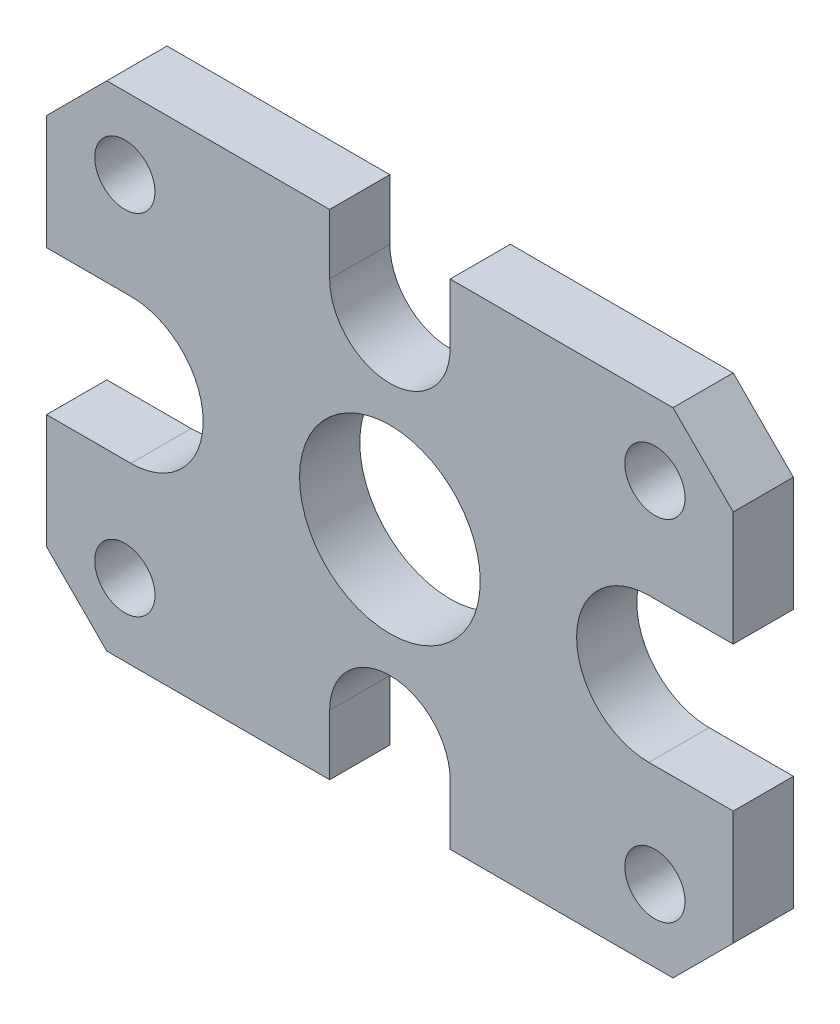
ISO-10303-21;
HEADER;
FILE_DESCRIPTION(('STEP AP214'),'2;1');
FILE_NAME('part.step','',(''),(''),'','','');
FILE_SCHEMA(('AUTOMOTIVE_DESIGN { 1 0 10303 214 1 1 1 1 }'));
ENDSEC;
DATA;
#1=APPLICATION_CONTEXT('core data for automotive mechanical design processes');
#2=APPLICATION_PROTOCOL_DEFINITION('international standard','automotive_design',2000,#1);
#3=PRODUCT_CONTEXT('',#1,'mechanical');
#4=PRODUCT('Part','Part','',(#3));
#5=PRODUCT_RELATED_PRODUCT_CATEGORY('part','',(#4));
#6=PRODUCT_DEFINITION_FORMATION('','',#4);
#7=PRODUCT_DEFINITION_CONTEXT('part definition',#1,'design');
#8=PRODUCT_DEFINITION('design','',#6,#7);
#9=PRODUCT_DEFINITION_SHAPE('','',#8);
#10=(LENGTH_UNIT() NAMED_UNIT(*) SI_UNIT(.MILLI.,.METRE.));
#11=(NAMED_UNIT(*) PLANE_ANGLE_UNIT() SI_UNIT($,.RADIAN.));
#12=(NAMED_UNIT(*) SI_UNIT($,.STERADIAN.) SOLID_ANGLE_UNIT());
#13=UNCERTAINTY_MEASURE_WITH_UNIT(LENGTH_MEASURE(1.E-05),#10,'distance_accuracy_value','');
#14=(GEOMETRIC_REPRESENTATION_CONTEXT(3) GLOBAL_UNCERTAINTY_ASSIGNED_CONTEXT((#13)) GLOBAL_UNIT_ASSIGNED_CONTEXT((#10,
#11,#12)) REPRESENTATION_CONTEXT('',''));
#15=CARTESIAN_POINT('',(0.,0.,0.));
#16=DIRECTION('',(0.,0.,1.));
#17=DIRECTION('',(1.,0.,0.));
#18=AXIS2_PLACEMENT_3D('',#15,#16,#17);
#19=CARTESIAN_POINT('',(-43.,0.,5.));
#20=DIRECTION('',(0.,0.,-1.));
#21=DIRECTION('',(-1.,0.,0.));
#22=AXIS2_PLACEMENT_3D('',#19,#20,#21);
#23=PLANE('',#22);
#24=DIRECTION('',(0.,-1.,0.));
#25=VECTOR('',#24,1.);
#26=CARTESIAN_POINT('',(-57.,-31.,5.));
#27=LINE('',#26,#25);
#28=CARTESIAN_POINT('',(-57.,-12.,5.));
#29=VERTEX_POINT('',#28);
#30=CARTESIAN_POINT('',(-57.,-31.,5.));
#31=VERTEX_POINT('',#30);
#32=EDGE_CURVE('E312',#29,#31,#27,.T.);
#33=ORIENTED_EDGE('',*,*,#32,.T.);
#34=DIRECTION('',(0.707106781186548,-0.707106781186548,0.));
#35=VECTOR('',#34,1.);
#36=CARTESIAN_POINT('',(-57.,-31.,5.));
#37=LINE('',#36,#35);
#38=CARTESIAN_POINT('',(-47.,-41.,5.));
#39=VERTEX_POINT('',#38);
#40=EDGE_CURVE('E152',#31,#39,#37,.T.);
#41=ORIENTED_EDGE('',*,*,#40,.T.);
#42=DIRECTION('',(1.,0.,0.));
#43=VECTOR('',#42,1.);
#44=CARTESIAN_POINT('',(-9.99999999999999,-41.,5.));
#45=LINE('',#44,#43);
#46=CARTESIAN_POINT('',(-9.99999999999999,-41.,5.));
#47=VERTEX_POINT('',#46);
#48=EDGE_CURVE('E397',#39,#47,#45,.T.);
#49=ORIENTED_EDGE('',*,*,#48,.T.);
#50=DIRECTION('',(0.,1.,0.));
#51=VECTOR('',#50,1.);
#52=CARTESIAN_POINT('',(-9.99999999999999,-41.,5.));
#53=LINE('',#52,#51);
#54=CARTESIAN_POINT('',(-9.99999999999999,-31.,5.));
#55=VERTEX_POINT('',#54);
#56=EDGE_CURVE('E417',#47,#55,#53,.T.);
#57=ORIENTED_EDGE('',*,*,#56,.T.);
#58=CARTESIAN_POINT('',(0.,-31.,5.));
#59=DIRECTION('',(0.,0.,-1.));
#60=DIRECTION('',(-1.,0.,0.));
#61=AXIS2_PLACEMENT_3D('',#58,#59,#60);
#62=CIRCLE('',#61,10.);
#63=CARTESIAN_POINT('',(10.,-31.,5.));
#64=VERTEX_POINT('',#63);
#65=EDGE_CURVE('E413',#55,#64,#62,.T.);
#66=ORIENTED_EDGE('',*,*,#65,.T.);
#67=DIRECTION('',(0.,-1.,0.));
#68=VECTOR('',#67,1.);
#69=CARTESIAN_POINT('',(10.,-31.,5.));
#70=LINE('',#69,#68);
#71=CARTESIAN_POINT('',(10.,-41.,5.));
#72=VERTEX_POINT('',#71);
#73=EDGE_CURVE('E416',#64,#72,#70,.T.);
#74=ORIENTED_EDGE('',*,*,#73,.T.);
#75=DIRECTION('',(1.,0.,0.));
#76=VECTOR('',#75,1.);
#77=CARTESIAN_POINT('',(47.,-41.,5.));
#78=LINE('',#77,#76);
#79=CARTESIAN_POINT('',(47.,-41.,5.));
#80=VERTEX_POINT('',#79);
#81=EDGE_CURVE('E421',#72,#80,#78,.T.);
#82=ORIENTED_EDGE('',*,*,#81,.T.);
#83=DIRECTION('',(0.707106781186548,0.707106781186548,0.));
#84=VECTOR('',#83,1.);
#85=CARTESIAN_POINT('',(57.,-31.,5.));
#86=LINE('',#85,#84);
#87=CARTESIAN_POINT('',(57.,-31.,5.));
#88=VERTEX_POINT('',#87);
#89=EDGE_CURVE('E428',#80,#88,#86,.T.);
#90=ORIENTED_EDGE('',*,*,#89,.T.);
#91=DIRECTION('',(0.,1.,0.));
#92=VECTOR('',#91,1.);
#93=CARTESIAN_POINT('',(57.,-31.,5.));
#94=LINE('',#93,#92);
#95=CARTESIAN_POINT('',(57.,-12.,5.));
#96=VERTEX_POINT('',#95);
#97=EDGE_CURVE('E431',#88,#96,#94,.T.);
#98=ORIENTED_EDGE('',*,*,#97,.T.);
#99=DIRECTION('',(-1.,0.,0.));
#100=VECTOR('',#99,1.);
#101=CARTESIAN_POINT('',(43.,-12.,5.));
#102=LINE('',#101,#100);
#103=CARTESIAN_POINT('',(43.,-12.,5.));
#104=VERTEX_POINT('',#103);
#105=EDGE_CURVE('E434',#96,#104,#102,.T.);
#106=ORIENTED_EDGE('',*,*,#105,.T.);
#107=CARTESIAN_POINT('',(43.,0.,5.));
#108=DIRECTION('',(0.,0.,-1.));
#109=DIRECTION('',(1.,0.,0.));
#110=AXIS2_PLACEMENT_3D('',#107,#108,#109);
#111=CIRCLE('',#110,12.);
#112=CARTESIAN_POINT('',(43.,12.,5.));
#113=VERTEX_POINT('',#112);
#114=EDGE_CURVE('E437',#104,#113,#111,.T.);
#115=ORIENTED_EDGE('',*,*,#114,.T.);
#116=DIRECTION('',(1.,0.,0.));
#117=VECTOR('',#116,1.);
#118=CARTESIAN_POINT('',(57.,12.,5.));
#119=LINE('',#118,#117);
#120=CARTESIAN_POINT('',(57.,12.,5.));
#121=VERTEX_POINT('',#120);
#122=EDGE_CURVE('E440',#113,#121,#119,.T.);
#123=ORIENTED_EDGE('',*,*,#122,.T.);
#124=DIRECTION('',(0.,1.,0.));
#125=VECTOR('',#124,1.);
#126=CARTESIAN_POINT('',(57.,12.,5.));
#127=LINE('',#126,#125);
#128=CARTESIAN_POINT('',(57.,31.,5.));
#129=VERTEX_POINT('',#128);
#130=EDGE_CURVE('E443',#121,#129,#127,.T.);
#131=ORIENTED_EDGE('',*,*,#130,.T.);
#132=DIRECTION('',(-0.707106781186548,0.707106781186547,0.));
#133=VECTOR('',#132,1.);
#134=CARTESIAN_POINT('',(57.,31.,5.));
#135=LINE('',#134,#133);
#136=CARTESIAN_POINT('',(47.,41.,5.));
#137=VERTEX_POINT('',#136);
#138=EDGE_CURVE('E446',#129,#137,#135,.T.);
#139=ORIENTED_EDGE('',*,*,#138,.T.);
#140=DIRECTION('',(-1.,0.,0.));
#141=VECTOR('',#140,1.);
#142=CARTESIAN_POINT('',(47.,41.,5.));
#143=LINE('',#142,#141);
#144=CARTESIAN_POINT('',(10.,41.,5.));
#145=VERTEX_POINT('',#144);
#146=EDGE_CURVE('E449',#137,#145,#143,.T.);
#147=ORIENTED_EDGE('',*,*,#146,.T.);
#148=DIRECTION('',(0.,-1.,0.));
#149=VECTOR('',#148,1.);
#150=CARTESIAN_POINT('',(10.,31.,5.));
#151=LINE('',#150,#149);
#152=CARTESIAN_POINT('',(10.,31.,5.));
#153=VERTEX_POINT('',#152);
#154=EDGE_CURVE('E452',#145,#153,#151,.T.);
#155=ORIENTED_EDGE('',*,*,#154,.T.);
#156=CARTESIAN_POINT('',(0.,31.,5.));
#157=DIRECTION('',(0.,0.,-1.));
#158=DIRECTION('',(1.,0.,0.));
#159=AXIS2_PLACEMENT_3D('',#156,#157,#158);
#160=CIRCLE('',#159,10.);
#161=CARTESIAN_POINT('',(-9.99999999999999,31.,5.));
#162=VERTEX_POINT('',#161);
#163=EDGE_CURVE('E455',#153,#162,#160,.T.);
#164=ORIENTED_EDGE('',*,*,#163,.T.);
#165=DIRECTION('',(0.,1.,0.));
#166=VECTOR('',#165,1.);
#167=CARTESIAN_POINT('',(-9.99999999999999,41.,5.));
#168=LINE('',#167,#166);
#169=CARTESIAN_POINT('',(-9.99999999999999,41.,5.));
#170=VERTEX_POINT('',#169);
#171=EDGE_CURVE('E458',#162,#170,#168,.T.);
#172=ORIENTED_EDGE('',*,*,#171,.T.);
#173=DIRECTION('',(-1.,0.,0.));
#174=VECTOR('',#173,1.);
#175=CARTESIAN_POINT('',(-9.99999999999999,41.,5.));
#176=LINE('',#175,#174);
#177=CARTESIAN_POINT('',(-47.,41.,5.));
#178=VERTEX_POINT('',#177);
#179=EDGE_CURVE('E461',#170,#178,#176,.T.);
#180=ORIENTED_EDGE('',*,*,#179,.T.);
#181=DIRECTION('',(-0.707106781186548,-0.707106781186548,0.));
#182=VECTOR('',#181,1.);
#183=CARTESIAN_POINT('',(-57.,31.,5.));
#184=LINE('',#183,#182);
#185=CARTESIAN_POINT('',(-57.,31.,5.));
#186=VERTEX_POINT('',#185);
#187=EDGE_CURVE('E464',#178,#186,#184,.T.);
#188=ORIENTED_EDGE('',*,*,#187,.T.);
#189=DIRECTION('',(0.,-1.,0.));
#190=VECTOR('',#189,1.);
#191=CARTESIAN_POINT('',(-57.,12.,5.));
#192=LINE('',#191,#190);
#193=CARTESIAN_POINT('',(-57.,12.,5.));
#194=VERTEX_POINT('',#193);
#195=EDGE_CURVE('E219',#186,#194,#192,.T.);
#196=ORIENTED_EDGE('',*,*,#195,.T.);
#197=DIRECTION('',(1.,0.,0.));
#198=VECTOR('',#197,1.);
#199=CARTESIAN_POINT('',(-57.,12.,5.));
#200=LINE('',#199,#198);
#201=CARTESIAN_POINT('',(-43.,12.,5.));
#202=VERTEX_POINT('',#201);
#203=EDGE_CURVE('E213',#194,#202,#200,.T.);
#204=ORIENTED_EDGE('',*,*,#203,.T.);
#205=CARTESIAN_POINT('',(-43.,0.,5.));
#206=DIRECTION('',(0.,0.,-1.));
#207=DIRECTION('',(-1.,0.,0.));
#208=AXIS2_PLACEMENT_3D('',#205,#206,#207);
#209=CIRCLE('',#208,12.);
#210=CARTESIAN_POINT('',(-43.,-12.,5.));
#211=VERTEX_POINT('',#210);
#212=EDGE_CURVE('E217',#202,#211,#209,.T.);
#213=ORIENTED_EDGE('',*,*,#212,.T.);
#214=DIRECTION('',(-1.,0.,0.));
#215=VECTOR('',#214,1.);
#216=CARTESIAN_POINT('',(-43.,-12.,5.));
#217=LINE('',#216,#215);
#218=EDGE_CURVE('E61',#211,#29,#217,.T.);
#219=ORIENTED_EDGE('',*,*,#218,.T.);
#220=EDGE_LOOP('',(#33,#41,#49,#57,#66,#74,#82,#90,#98,#106,#115,#123,#131,#139,#147,#155,#164,
#172,#180,#188,#196,#204,#213,#219));
#221=FACE_BOUND('',#220,.T.);
#222=CARTESIAN_POINT('',(0.,0.,5.));
#223=DIRECTION('',(0.,0.,1.));
#224=DIRECTION('',(1.,0.,0.));
#225=AXIS2_PLACEMENT_3D('',#222,#223,#224);
#226=CIRCLE('',#225,15.);
#227=CARTESIAN_POINT('',(15.,0.,5.));
#228=VERTEX_POINT('',#227);
#229=EDGE_CURVE('E246',#228,#228,#226,.T.);
#230=ORIENTED_EDGE('',*,*,#229,.F.);
#231=EDGE_LOOP('',(#230));
#232=FACE_BOUND('',#231,.T.);
#233=CARTESIAN_POINT('',(-44.,-29.,5.));
#234=DIRECTION('',(0.,0.,1.));
#235=DIRECTION('',(1.,0.,0.));
#236=AXIS2_PLACEMENT_3D('',#233,#234,#235);
#237=CIRCLE('',#236,5.);
#238=CARTESIAN_POINT('',(-39.,-29.,5.));
#239=VERTEX_POINT('',#238);
#240=EDGE_CURVE('E546',#239,#239,#237,.T.);
#241=ORIENTED_EDGE('',*,*,#240,.F.);
#242=EDGE_LOOP('',(#241));
#243=FACE_BOUND('',#242,.T.);
#244=CARTESIAN_POINT('',(-44.,29.,5.));
#245=DIRECTION('',(0.,0.,1.));
#246=DIRECTION('',(-1.,0.,0.));
#247=AXIS2_PLACEMENT_3D('',#244,#245,#246);
#248=CIRCLE('',#247,5.);
#249=CARTESIAN_POINT('',(-49.,29.,5.));
#250=VERTEX_POINT('',#249);
#251=EDGE_CURVE('E538',#250,#250,#248,.T.);
#252=ORIENTED_EDGE('',*,*,#251,.F.);
#253=EDGE_LOOP('',(#252));
#254=FACE_BOUND('',#253,.T.);
#255=CARTESIAN_POINT('',(44.,-29.,5.));
#256=DIRECTION('',(0.,0.,1.));
#257=DIRECTION('',(-1.,0.,0.));
#258=AXIS2_PLACEMENT_3D('',#255,#256,#257);
#259=CIRCLE('',#258,5.);
#260=CARTESIAN_POINT('',(39.,-29.,5.));
#261=VERTEX_POINT('',#260);
#262=EDGE_CURVE('E530',#261,#261,#259,.T.);
#263=ORIENTED_EDGE('',*,*,#262,.F.);
#264=EDGE_LOOP('',(#263));
#265=FACE_BOUND('',#264,.T.);
#266=CARTESIAN_POINT('',(44.,29.,5.));
#267=DIRECTION('',(0.,0.,1.));
#268=DIRECTION('',(1.,0.,0.));
#269=AXIS2_PLACEMENT_3D('',#266,#267,#268);
#270=CIRCLE('',#269,5.);
#271=CARTESIAN_POINT('',(49.,29.,5.));
#272=VERTEX_POINT('',#271);
#273=EDGE_CURVE('E519',#272,#272,#270,.T.);
#274=ORIENTED_EDGE('',*,*,#273,.F.);
#275=EDGE_LOOP('',(#274));
#276=FACE_BOUND('',#275,.T.);
#277=ADVANCED_FACE('F43',(#221,#232,#243,#254,#265,#276),#23,.F.);
#278=CARTESIAN_POINT('',(-43.,0.,-5.));
#279=DIRECTION('',(0.,0.,-1.));
#280=DIRECTION('',(-1.,0.,0.));
#281=AXIS2_PLACEMENT_3D('',#278,#279,#280);
#282=PLANE('',#281);
#283=CARTESIAN_POINT('',(44.,-29.,-5.));
#284=DIRECTION('',(0.,0.,1.));
#285=DIRECTION('',(-1.,0.,0.));
#286=AXIS2_PLACEMENT_3D('',#283,#284,#285);
#287=CIRCLE('',#286,5.);
#288=CARTESIAN_POINT('',(39.,-29.,-5.));
#289=VERTEX_POINT('',#288);
#290=EDGE_CURVE('E527',#289,#289,#287,.T.);
#291=ORIENTED_EDGE('',*,*,#290,.T.);
#292=EDGE_LOOP('',(#291));
#293=FACE_BOUND('',#292,.T.);
#294=CARTESIAN_POINT('',(-44.,-29.,-5.));
#295=DIRECTION('',(0.,0.,1.));
#296=DIRECTION('',(1.,0.,0.));
#297=AXIS2_PLACEMENT_3D('',#294,#295,#296);
#298=CIRCLE('',#297,5.);
#299=CARTESIAN_POINT('',(-39.,-29.,-5.));
#300=VERTEX_POINT('',#299);
#301=EDGE_CURVE('E542',#300,#300,#298,.T.);
#302=ORIENTED_EDGE('',*,*,#301,.T.);
#303=EDGE_LOOP('',(#302));
#304=FACE_BOUND('',#303,.T.);
#305=DIRECTION('',(0.,-1.,0.));
#306=VECTOR('',#305,1.);
#307=CARTESIAN_POINT('',(-57.,-31.,-5.));
#308=LINE('',#307,#306);
#309=CARTESIAN_POINT('',(-57.,-12.,-5.));
#310=VERTEX_POINT('',#309);
#311=CARTESIAN_POINT('',(-57.,-31.,-5.));
#312=VERTEX_POINT('',#311);
#313=EDGE_CURVE('E241',#310,#312,#308,.T.);
#314=ORIENTED_EDGE('',*,*,#313,.F.);
#315=DIRECTION('',(-1.,0.,0.));
#316=VECTOR('',#315,1.);
#317=CARTESIAN_POINT('',(-43.,-12.,-5.));
#318=LINE('',#317,#316);
#319=CARTESIAN_POINT('',(-43.,-12.,-5.));
#320=VERTEX_POINT('',#319);
#321=EDGE_CURVE('E144',#320,#310,#318,.T.);
#322=ORIENTED_EDGE('',*,*,#321,.F.);
#323=CARTESIAN_POINT('',(-43.,0.,-5.));
#324=DIRECTION('',(0.,0.,-1.));
#325=DIRECTION('',(-1.,0.,0.));
#326=AXIS2_PLACEMENT_3D('',#323,#324,#325);
#327=CIRCLE('',#326,12.);
#328=CARTESIAN_POINT('',(-43.,12.,-5.));
#329=VERTEX_POINT('',#328);
#330=EDGE_CURVE('E138',#329,#320,#327,.T.);
#331=ORIENTED_EDGE('',*,*,#330,.F.);
#332=DIRECTION('',(1.,0.,0.));
#333=VECTOR('',#332,1.);
#334=CARTESIAN_POINT('',(-57.,12.,-5.));
#335=LINE('',#334,#333);
#336=CARTESIAN_POINT('',(-57.,12.,-5.));
#337=VERTEX_POINT('',#336);
#338=EDGE_CURVE('E228',#337,#329,#335,.T.);
#339=ORIENTED_EDGE('',*,*,#338,.F.);
#340=DIRECTION('',(0.,-1.,0.));
#341=VECTOR('',#340,1.);
#342=CARTESIAN_POINT('',(-57.,12.,-5.));
#343=LINE('',#342,#341);
#344=CARTESIAN_POINT('',(-57.,31.,-5.));
#345=VERTEX_POINT('',#344);
#346=EDGE_CURVE('E303',#345,#337,#343,.T.);
#347=ORIENTED_EDGE('',*,*,#346,.F.);
#348=DIRECTION('',(-0.707106781186548,-0.707106781186548,0.));
#349=VECTOR('',#348,1.);
#350=CARTESIAN_POINT('',(-57.,31.,-5.));
#351=LINE('',#350,#349);
#352=CARTESIAN_POINT('',(-47.,41.,-5.));
#353=VERTEX_POINT('',#352);
#354=EDGE_CURVE('E300',#353,#345,#351,.T.);
#355=ORIENTED_EDGE('',*,*,#354,.F.);
#356=DIRECTION('',(-1.,0.,0.));
#357=VECTOR('',#356,1.);
#358=CARTESIAN_POINT('',(-9.99999999999999,41.,-5.));
#359=LINE('',#358,#357);
#360=CARTESIAN_POINT('',(-9.99999999999999,41.,-5.));
#361=VERTEX_POINT('',#360);
#362=EDGE_CURVE('E297',#361,#353,#359,.T.);
#363=ORIENTED_EDGE('',*,*,#362,.F.);
#364=DIRECTION('',(0.,1.,0.));
#365=VECTOR('',#364,1.);
#366=CARTESIAN_POINT('',(-9.99999999999999,41.,-5.));
#367=LINE('',#366,#365);
#368=CARTESIAN_POINT('',(-9.99999999999999,31.,-5.));
#369=VERTEX_POINT('',#368);
#370=EDGE_CURVE('E294',#369,#361,#367,.T.);
#371=ORIENTED_EDGE('',*,*,#370,.F.);
#372=CARTESIAN_POINT('',(0.,31.,-5.));
#373=DIRECTION('',(0.,0.,-1.));
#374=DIRECTION('',(1.,0.,0.));
#375=AXIS2_PLACEMENT_3D('',#372,#373,#374);
#376=CIRCLE('',#375,10.);
#377=CARTESIAN_POINT('',(10.,31.,-5.));
#378=VERTEX_POINT('',#377);
#379=EDGE_CURVE('E291',#378,#369,#376,.T.);
#380=ORIENTED_EDGE('',*,*,#379,.F.);
#381=DIRECTION('',(0.,-1.,0.));
#382=VECTOR('',#381,1.);
#383=CARTESIAN_POINT('',(10.,31.,-5.));
#384=LINE('',#383,#382);
#385=CARTESIAN_POINT('',(10.,41.,-5.));
#386=VERTEX_POINT('',#385);
#387=EDGE_CURVE('E288',#386,#378,#384,.T.);
#388=ORIENTED_EDGE('',*,*,#387,.F.);
#389=DIRECTION('',(-1.,0.,0.));
#390=VECTOR('',#389,1.);
#391=CARTESIAN_POINT('',(47.,41.,-5.));
#392=LINE('',#391,#390);
#393=CARTESIAN_POINT('',(47.,41.,-5.));
#394=VERTEX_POINT('',#393);
#395=EDGE_CURVE('E285',#394,#386,#392,.T.);
#396=ORIENTED_EDGE('',*,*,#395,.F.);
#397=DIRECTION('',(-0.707106781186548,0.707106781186547,0.));
#398=VECTOR('',#397,1.);
#399=CARTESIAN_POINT('',(57.,31.,-5.));
#400=LINE('',#399,#398);
#401=CARTESIAN_POINT('',(57.,31.,-5.));
#402=VERTEX_POINT('',#401);
#403=EDGE_CURVE('E282',#402,#394,#400,.T.);
#404=ORIENTED_EDGE('',*,*,#403,.F.);
#405=DIRECTION('',(0.,1.,0.));
#406=VECTOR('',#405,1.);
#407=CARTESIAN_POINT('',(57.,12.,-5.));
#408=LINE('',#407,#406);
#409=CARTESIAN_POINT('',(57.,12.,-5.));
#410=VERTEX_POINT('',#409);
#411=EDGE_CURVE('E279',#410,#402,#408,.T.);
#412=ORIENTED_EDGE('',*,*,#411,.F.);
#413=DIRECTION('',(1.,0.,0.));
#414=VECTOR('',#413,1.);
#415=CARTESIAN_POINT('',(57.,12.,-5.));
#416=LINE('',#415,#414);
#417=CARTESIAN_POINT('',(43.,12.,-5.));
#418=VERTEX_POINT('',#417);
#419=EDGE_CURVE('E276',#418,#410,#416,.T.);
#420=ORIENTED_EDGE('',*,*,#419,.F.);
#421=CARTESIAN_POINT('',(43.,0.,-5.));
#422=DIRECTION('',(0.,0.,-1.));
#423=DIRECTION('',(1.,0.,0.));
#424=AXIS2_PLACEMENT_3D('',#421,#422,#423);
#425=CIRCLE('',#424,12.);
#426=CARTESIAN_POINT('',(43.,-12.,-5.));
#427=VERTEX_POINT('',#426);
#428=EDGE_CURVE('E273',#427,#418,#425,.T.);
#429=ORIENTED_EDGE('',*,*,#428,.F.);
#430=DIRECTION('',(-1.,0.,0.));
#431=VECTOR('',#430,1.);
#432=CARTESIAN_POINT('',(43.,-12.,-5.));
#433=LINE('',#432,#431);
#434=CARTESIAN_POINT('',(57.,-12.,-5.));
#435=VERTEX_POINT('',#434);
#436=EDGE_CURVE('E270',#435,#427,#433,.T.);
#437=ORIENTED_EDGE('',*,*,#436,.F.);
#438=DIRECTION('',(0.,1.,0.));
#439=VECTOR('',#438,1.);
#440=CARTESIAN_POINT('',(57.,-31.,-5.));
#441=LINE('',#440,#439);
#442=CARTESIAN_POINT('',(57.,-31.,-5.));
#443=VERTEX_POINT('',#442);
#444=EDGE_CURVE('E267',#443,#435,#441,.T.);
#445=ORIENTED_EDGE('',*,*,#444,.F.);
#446=DIRECTION('',(0.707106781186548,0.707106781186548,0.));
#447=VECTOR('',#446,1.);
#448=CARTESIAN_POINT('',(57.,-31.,-5.));
#449=LINE('',#448,#447);
#450=CARTESIAN_POINT('',(47.,-41.,-5.));
#451=VERTEX_POINT('',#450);
#452=EDGE_CURVE('E264',#451,#443,#449,.T.);
#453=ORIENTED_EDGE('',*,*,#452,.F.);
#454=DIRECTION('',(1.,0.,0.));
#455=VECTOR('',#454,1.);
#456=CARTESIAN_POINT('',(47.,-41.,-5.));
#457=LINE('',#456,#455);
#458=CARTESIAN_POINT('',(10.,-41.,-5.));
#459=VERTEX_POINT('',#458);
#460=EDGE_CURVE('E261',#459,#451,#457,.T.);
#461=ORIENTED_EDGE('',*,*,#460,.F.);
#462=DIRECTION('',(0.,-1.,0.));
#463=VECTOR('',#462,1.);
#464=CARTESIAN_POINT('',(10.,-31.,-5.));
#465=LINE('',#464,#463);
#466=CARTESIAN_POINT('',(10.,-31.,-5.));
#467=VERTEX_POINT('',#466);
#468=EDGE_CURVE('E258',#467,#459,#465,.T.);
#469=ORIENTED_EDGE('',*,*,#468,.F.);
#470=CARTESIAN_POINT('',(0.,-31.,-5.));
#471=DIRECTION('',(0.,0.,-1.));
#472=DIRECTION('',(-1.,0.,0.));
#473=AXIS2_PLACEMENT_3D('',#470,#471,#472);
#474=CIRCLE('',#473,10.);
#475=CARTESIAN_POINT('',(-9.99999999999999,-31.,-5.));
#476=VERTEX_POINT('',#475);
#477=EDGE_CURVE('E255',#476,#467,#474,.T.);
#478=ORIENTED_EDGE('',*,*,#477,.F.);
#479=DIRECTION('',(0.,1.,0.));
#480=VECTOR('',#479,1.);
#481=CARTESIAN_POINT('',(-9.99999999999999,-41.,-5.));
#482=LINE('',#481,#480);
#483=CARTESIAN_POINT('',(-9.99999999999999,-41.,-5.));
#484=VERTEX_POINT('',#483);
#485=EDGE_CURVE('E252',#484,#476,#482,.T.);
#486=ORIENTED_EDGE('',*,*,#485,.F.);
#487=DIRECTION('',(1.,0.,0.));
#488=VECTOR('',#487,1.);
#489=CARTESIAN_POINT('',(-9.99999999999999,-41.,-5.));
#490=LINE('',#489,#488);
#491=CARTESIAN_POINT('',(-47.,-41.,-5.));
#492=VERTEX_POINT('',#491);
#493=EDGE_CURVE('E249',#492,#484,#490,.T.);
#494=ORIENTED_EDGE('',*,*,#493,.F.);
#495=DIRECTION('',(0.707106781186548,-0.707106781186548,0.));
#496=VECTOR('',#495,1.);
#497=CARTESIAN_POINT('',(-57.,-31.,-5.));
#498=LINE('',#497,#496);
#499=EDGE_CURVE('E245',#312,#492,#498,.T.);
#500=ORIENTED_EDGE('',*,*,#499,.F.);
#501=EDGE_LOOP('',(#314,#322,#331,#339,#347,#355,#363,#371,#380,#388,#396,#404,#412,#420,#429,
#437,#445,#453,#461,#469,#478,#486,#494,#500));
#502=FACE_BOUND('',#501,.T.);
#503=CARTESIAN_POINT('',(0.,0.,-5.));
#504=DIRECTION('',(0.,0.,1.));
#505=DIRECTION('',(1.,0.,0.));
#506=AXIS2_PLACEMENT_3D('',#503,#504,#505);
#507=CIRCLE('',#506,15.);
#508=CARTESIAN_POINT('',(15.,0.,-5.));
#509=VERTEX_POINT('',#508);
#510=EDGE_CURVE('E550',#509,#509,#507,.T.);
#511=ORIENTED_EDGE('',*,*,#510,.T.);
#512=EDGE_LOOP('',(#511));
#513=FACE_BOUND('',#512,.T.);
#514=CARTESIAN_POINT('',(-44.,29.,-5.));
#515=DIRECTION('',(0.,0.,1.));
#516=DIRECTION('',(-1.,0.,0.));
#517=AXIS2_PLACEMENT_3D('',#514,#515,#516);
#518=CIRCLE('',#517,5.);
#519=CARTESIAN_POINT('',(-49.,29.,-5.));
#520=VERTEX_POINT('',#519);
#521=EDGE_CURVE('E534',#520,#520,#518,.T.);
#522=ORIENTED_EDGE('',*,*,#521,.T.);
#523=EDGE_LOOP('',(#522));
#524=FACE_BOUND('',#523,.T.);
#525=CARTESIAN_POINT('',(44.,29.,-5.));
#526=DIRECTION('',(0.,0.,1.));
#527=DIRECTION('',(1.,0.,0.));
#528=AXIS2_PLACEMENT_3D('',#525,#526,#527);
#529=CIRCLE('',#528,5.);
#530=CARTESIAN_POINT('',(49.,29.,-5.));
#531=VERTEX_POINT('',#530);
#532=EDGE_CURVE('E522',#531,#531,#529,.T.);
#533=ORIENTED_EDGE('',*,*,#532,.T.);
#534=EDGE_LOOP('',(#533));
#535=FACE_BOUND('',#534,.T.);
#536=ADVANCED_FACE('F401',(#293,#304,#502,#513,#524,#535),#282,.T.);
#537=CARTESIAN_POINT('',(-57.,-31.,5.));
#538=DIRECTION('',(1.,0.,0.));
#539=DIRECTION('',(0.,0.,-1.));
#540=AXIS2_PLACEMENT_3D('',#537,#538,#539);
#541=PLANE('',#540);
#542=ORIENTED_EDGE('',*,*,#313,.T.);
#543=DIRECTION('',(0.,0.,-1.));
#544=VECTOR('',#543,1.);
#545=CARTESIAN_POINT('',(-57.,-31.,5.));
#546=LINE('',#545,#544);
#547=EDGE_CURVE('E11',#31,#312,#546,.T.);
#548=ORIENTED_EDGE('',*,*,#547,.F.);
#549=ORIENTED_EDGE('',*,*,#32,.F.);
#550=DIRECTION('',(0.,0.,-1.));
#551=VECTOR('',#550,1.);
#552=CARTESIAN_POINT('',(-57.,-12.,5.));
#553=LINE('',#552,#551);
#554=EDGE_CURVE('E237',#29,#310,#553,.T.);
#555=ORIENTED_EDGE('',*,*,#554,.T.);
#556=EDGE_LOOP('',(#542,#548,#549,#555));
#557=FACE_BOUND('',#556,.T.);
#558=ADVANCED_FACE('F45',(#557),#541,.F.);
#559=CARTESIAN_POINT('',(-57.,-31.,5.));
#560=DIRECTION('',(0.707106781186548,0.707106781186548,0.));
#561=DIRECTION('',(-0.707106781186548,0.707106781186548,0.));
#562=AXIS2_PLACEMENT_3D('',#559,#560,#561);
#563=PLANE('',#562);
#564=ORIENTED_EDGE('',*,*,#499,.T.);
#565=DIRECTION('',(0.,0.,-1.));
#566=VECTOR('',#565,1.);
#567=CARTESIAN_POINT('',(-47.,-41.,5.));
#568=LINE('',#567,#566);
#569=EDGE_CURVE('E53',#39,#492,#568,.T.);
#570=ORIENTED_EDGE('',*,*,#569,.F.);
#571=ORIENTED_EDGE('',*,*,#40,.F.);
#572=ORIENTED_EDGE('',*,*,#547,.T.);
#573=EDGE_LOOP('',(#564,#570,#571,#572));
#574=FACE_BOUND('',#573,.T.);
#575=ADVANCED_FACE('F819',(#574),#563,.F.);
#576=CARTESIAN_POINT('',(-9.99999999999999,-41.,5.));
#577=DIRECTION('',(0.,1.,0.));
#578=DIRECTION('',(-1.,0.,0.));
#579=AXIS2_PLACEMENT_3D('',#576,#577,#578);
#580=PLANE('',#579);
#581=ORIENTED_EDGE('',*,*,#493,.T.);
#582=DIRECTION('',(0.,0.,-1.));
#583=VECTOR('',#582,1.);
#584=CARTESIAN_POINT('',(-9.99999999999999,-41.,5.));
#585=LINE('',#584,#583);
#586=EDGE_CURVE('E387',#47,#484,#585,.T.);
#587=ORIENTED_EDGE('',*,*,#586,.F.);
#588=ORIENTED_EDGE('',*,*,#48,.F.);
#589=ORIENTED_EDGE('',*,*,#569,.T.);
#590=EDGE_LOOP('',(#581,#587,#588,#589));
#591=FACE_BOUND('',#590,.T.);
#592=ADVANCED_FACE('F395',(#591),#580,.F.);
#593=CARTESIAN_POINT('',(-9.99999999999999,-41.,5.));
#594=DIRECTION('',(-1.,0.,0.));
#595=DIRECTION('',(0.,0.,1.));
#596=AXIS2_PLACEMENT_3D('',#593,#594,#595);
#597=PLANE('',#596);
#598=ORIENTED_EDGE('',*,*,#485,.T.);
#599=DIRECTION('',(0.,0.,-1.));
#600=VECTOR('',#599,1.);
#601=CARTESIAN_POINT('',(-9.99999999999999,-31.,5.));
#602=LINE('',#601,#600);
#603=EDGE_CURVE('E383',#55,#476,#602,.T.);
#604=ORIENTED_EDGE('',*,*,#603,.F.);
#605=ORIENTED_EDGE('',*,*,#56,.F.);
#606=ORIENTED_EDGE('',*,*,#586,.T.);
#607=EDGE_LOOP('',(#598,#604,#605,#606));
#608=FACE_BOUND('',#607,.T.);
#609=ADVANCED_FACE('F407',(#608),#597,.F.);
#610=CARTESIAN_POINT('',(0.,-31.,5.));
#611=DIRECTION('',(0.,0.,-1.));
#612=DIRECTION('',(-1.,0.,0.));
#613=AXIS2_PLACEMENT_3D('',#610,#611,#612);
#614=CYLINDRICAL_SURFACE('',#613,10.);
#615=ORIENTED_EDGE('',*,*,#477,.T.);
#616=DIRECTION('',(0.,0.,-1.));
#617=VECTOR('',#616,1.);
#618=CARTESIAN_POINT('',(10.,-31.,5.));
#619=LINE('',#618,#617);
#620=EDGE_CURVE('E379',#64,#467,#619,.T.);
#621=ORIENTED_EDGE('',*,*,#620,.F.);
#622=ORIENTED_EDGE('',*,*,#65,.F.);
#623=ORIENTED_EDGE('',*,*,#603,.T.);
#624=EDGE_LOOP('',(#615,#621,#622,#623));
#625=FACE_BOUND('',#624,.T.);
#626=ADVANCED_FACE('F411',(#625),#614,.F.);
#627=CARTESIAN_POINT('',(10.,-31.,5.));
#628=DIRECTION('',(1.,0.,0.));
#629=DIRECTION('',(0.,1.,0.));
#630=AXIS2_PLACEMENT_3D('',#627,#628,#629);
#631=PLANE('',#630);
#632=ORIENTED_EDGE('',*,*,#468,.T.);
#633=DIRECTION('',(0.,0.,-1.));
#634=VECTOR('',#633,1.);
#635=CARTESIAN_POINT('',(10.,-41.,5.));
#636=LINE('',#635,#634);
#637=EDGE_CURVE('E375',#72,#459,#636,.T.);
#638=ORIENTED_EDGE('',*,*,#637,.F.);
#639=ORIENTED_EDGE('',*,*,#73,.F.);
#640=ORIENTED_EDGE('',*,*,#620,.T.);
#641=EDGE_LOOP('',(#632,#638,#639,#640));
#642=FACE_BOUND('',#641,.T.);
#643=ADVANCED_FACE('F780',(#642),#631,.F.);
#644=CARTESIAN_POINT('',(47.,-41.,5.));
#645=DIRECTION('',(0.,1.,0.));
#646=DIRECTION('',(-1.,0.,0.));
#647=AXIS2_PLACEMENT_3D('',#644,#645,#646);
#648=PLANE('',#647);
#649=ORIENTED_EDGE('',*,*,#460,.T.);
#650=DIRECTION('',(0.,0.,-1.));
#651=VECTOR('',#650,1.);
#652=CARTESIAN_POINT('',(47.,-41.,5.));
#653=LINE('',#652,#651);
#654=EDGE_CURVE('E371',#80,#451,#653,.T.);
#655=ORIENTED_EDGE('',*,*,#654,.F.);
#656=ORIENTED_EDGE('',*,*,#81,.F.);
#657=ORIENTED_EDGE('',*,*,#637,.T.);
#658=EDGE_LOOP('',(#649,#655,#656,#657));
#659=FACE_BOUND('',#658,.T.);
#660=ADVANCED_FACE('F769',(#659),#648,.F.);
#661=CARTESIAN_POINT('',(57.,-31.,5.));
#662=DIRECTION('',(-0.707106781186548,0.707106781186548,0.));
#663=DIRECTION('',(-0.707106781186548,-0.707106781186548,0.));
#664=AXIS2_PLACEMENT_3D('',#661,#662,#663);
#665=PLANE('',#664);
#666=ORIENTED_EDGE('',*,*,#452,.T.);
#667=DIRECTION('',(0.,0.,-1.));
#668=VECTOR('',#667,1.);
#669=CARTESIAN_POINT('',(57.,-31.,5.));
#670=LINE('',#669,#668);
#671=EDGE_CURVE('E367',#88,#443,#670,.T.);
#672=ORIENTED_EDGE('',*,*,#671,.F.);
#673=ORIENTED_EDGE('',*,*,#89,.F.);
#674=ORIENTED_EDGE('',*,*,#654,.T.);
#675=EDGE_LOOP('',(#666,#672,#673,#674));
#676=FACE_BOUND('',#675,.T.);
#677=ADVANCED_FACE('F758',(#676),#665,.F.);
#678=CARTESIAN_POINT('',(57.,-31.,5.));
#679=DIRECTION('',(-1.,0.,0.));
#680=DIRECTION('',(0.,-1.,0.));
#681=AXIS2_PLACEMENT_3D('',#678,#679,#680);
#682=PLANE('',#681);
#683=ORIENTED_EDGE('',*,*,#444,.T.);
#684=DIRECTION('',(0.,0.,-1.));
#685=VECTOR('',#684,1.);
#686=CARTESIAN_POINT('',(57.,-12.,5.));
#687=LINE('',#686,#685);
#688=EDGE_CURVE('E363',#96,#435,#687,.T.);
#689=ORIENTED_EDGE('',*,*,#688,.F.);
#690=ORIENTED_EDGE('',*,*,#97,.F.);
#691=ORIENTED_EDGE('',*,*,#671,.T.);
#692=EDGE_LOOP('',(#683,#689,#690,#691));
#693=FACE_BOUND('',#692,.T.);
#694=ADVANCED_FACE('F747',(#693),#682,.F.);
#695=CARTESIAN_POINT('',(43.,-12.,5.));
#696=DIRECTION('',(0.,-1.,0.));
#697=DIRECTION('',(1.,0.,0.));
#698=AXIS2_PLACEMENT_3D('',#695,#696,#697);
#699=PLANE('',#698);
#700=ORIENTED_EDGE('',*,*,#436,.T.);
#701=DIRECTION('',(0.,0.,-1.));
#702=VECTOR('',#701,1.);
#703=CARTESIAN_POINT('',(43.,-12.,5.));
#704=LINE('',#703,#702);
#705=EDGE_CURVE('E359',#104,#427,#704,.T.);
#706=ORIENTED_EDGE('',*,*,#705,.F.);
#707=ORIENTED_EDGE('',*,*,#105,.F.);
#708=ORIENTED_EDGE('',*,*,#688,.T.);
#709=EDGE_LOOP('',(#700,#706,#707,#708));
#710=FACE_BOUND('',#709,.T.);
#711=ADVANCED_FACE('F736',(#710),#699,.F.);
#712=CARTESIAN_POINT('',(43.,0.,5.));
#713=DIRECTION('',(0.,0.,-1.));
#714=DIRECTION('',(-1.,0.,0.));
#715=AXIS2_PLACEMENT_3D('',#712,#713,#714);
#716=CYLINDRICAL_SURFACE('',#715,12.);
#717=ORIENTED_EDGE('',*,*,#428,.T.);
#718=DIRECTION('',(0.,0.,-1.));
#719=VECTOR('',#718,1.);
#720=CARTESIAN_POINT('',(43.,12.,5.));
#721=LINE('',#720,#719);
#722=EDGE_CURVE('E355',#113,#418,#721,.T.);
#723=ORIENTED_EDGE('',*,*,#722,.F.);
#724=ORIENTED_EDGE('',*,*,#114,.F.);
#725=ORIENTED_EDGE('',*,*,#705,.T.);
#726=EDGE_LOOP('',(#717,#723,#724,#725));
#727=FACE_BOUND('',#726,.T.);
#728=ADVANCED_FACE('F725',(#727),#716,.F.);
#729=CARTESIAN_POINT('',(57.,12.,5.));
#730=DIRECTION('',(0.,1.,0.));
#731=DIRECTION('',(-1.,0.,0.));
#732=AXIS2_PLACEMENT_3D('',#729,#730,#731);
#733=PLANE('',#732);
#734=ORIENTED_EDGE('',*,*,#419,.T.);
#735=DIRECTION('',(0.,0.,-1.));
#736=VECTOR('',#735,1.);
#737=CARTESIAN_POINT('',(57.,12.,5.));
#738=LINE('',#737,#736);
#739=EDGE_CURVE('E351',#121,#410,#738,.T.);
#740=ORIENTED_EDGE('',*,*,#739,.F.);
#741=ORIENTED_EDGE('',*,*,#122,.F.);
#742=ORIENTED_EDGE('',*,*,#722,.T.);
#743=EDGE_LOOP('',(#734,#740,#741,#742));
#744=FACE_BOUND('',#743,.T.);
#745=ADVANCED_FACE('F714',(#744),#733,.F.);
#746=CARTESIAN_POINT('',(57.,12.,5.));
#747=DIRECTION('',(-1.,0.,0.));
#748=DIRECTION('',(0.,-1.,0.));
#749=AXIS2_PLACEMENT_3D('',#746,#747,#748);
#750=PLANE('',#749);
#751=ORIENTED_EDGE('',*,*,#411,.T.);
#752=DIRECTION('',(0.,0.,-1.));
#753=VECTOR('',#752,1.);
#754=CARTESIAN_POINT('',(57.,31.,5.));
#755=LINE('',#754,#753);
#756=EDGE_CURVE('E347',#129,#402,#755,.T.);
#757=ORIENTED_EDGE('',*,*,#756,.F.);
#758=ORIENTED_EDGE('',*,*,#130,.F.);
#759=ORIENTED_EDGE('',*,*,#739,.T.);
#760=EDGE_LOOP('',(#751,#757,#758,#759));
#761=FACE_BOUND('',#760,.T.);
#762=ADVANCED_FACE('F703',(#761),#750,.F.);
#763=CARTESIAN_POINT('',(57.,31.,5.));
#764=DIRECTION('',(-0.707106781186547,-0.707106781186548,0.));
#765=DIRECTION('',(0.707106781186548,-0.707106781186547,0.));
#766=AXIS2_PLACEMENT_3D('',#763,#764,#765);
#767=PLANE('',#766);
#768=ORIENTED_EDGE('',*,*,#403,.T.);
#769=DIRECTION('',(0.,0.,-1.));
#770=VECTOR('',#769,1.);
#771=CARTESIAN_POINT('',(47.,41.,5.));
#772=LINE('',#771,#770);
#773=EDGE_CURVE('E343',#137,#394,#772,.T.);
#774=ORIENTED_EDGE('',*,*,#773,.F.);
#775=ORIENTED_EDGE('',*,*,#138,.F.);
#776=ORIENTED_EDGE('',*,*,#756,.T.);
#777=EDGE_LOOP('',(#768,#774,#775,#776));
#778=FACE_BOUND('',#777,.T.);
#779=ADVANCED_FACE('F692',(#778),#767,.F.);
#780=CARTESIAN_POINT('',(47.,41.,5.));
#781=DIRECTION('',(0.,-1.,0.));
#782=DIRECTION('',(1.,0.,0.));
#783=AXIS2_PLACEMENT_3D('',#780,#781,#782);
#784=PLANE('',#783);
#785=ORIENTED_EDGE('',*,*,#395,.T.);
#786=DIRECTION('',(0.,0.,-1.));
#787=VECTOR('',#786,1.);
#788=CARTESIAN_POINT('',(10.,41.,5.));
#789=LINE('',#788,#787);
#790=EDGE_CURVE('E339',#145,#386,#789,.T.);
#791=ORIENTED_EDGE('',*,*,#790,.F.);
#792=ORIENTED_EDGE('',*,*,#146,.F.);
#793=ORIENTED_EDGE('',*,*,#773,.T.);
#794=EDGE_LOOP('',(#785,#791,#792,#793));
#795=FACE_BOUND('',#794,.T.);
#796=ADVANCED_FACE('F681',(#795),#784,.F.);
#797=CARTESIAN_POINT('',(10.,31.,5.));
#798=DIRECTION('',(1.,0.,0.));
#799=DIRECTION('',(0.,1.,0.));
#800=AXIS2_PLACEMENT_3D('',#797,#798,#799);
#801=PLANE('',#800);
#802=ORIENTED_EDGE('',*,*,#387,.T.);
#803=DIRECTION('',(0.,0.,-1.));
#804=VECTOR('',#803,1.);
#805=CARTESIAN_POINT('',(10.,31.,5.));
#806=LINE('',#805,#804);
#807=EDGE_CURVE('E335',#153,#378,#806,.T.);
#808=ORIENTED_EDGE('',*,*,#807,.F.);
#809=ORIENTED_EDGE('',*,*,#154,.F.);
#810=ORIENTED_EDGE('',*,*,#790,.T.);
#811=EDGE_LOOP('',(#802,#808,#809,#810));
#812=FACE_BOUND('',#811,.T.);
#813=ADVANCED_FACE('F670',(#812),#801,.F.);
#814=CARTESIAN_POINT('',(0.,31.,5.));
#815=DIRECTION('',(0.,0.,-1.));
#816=DIRECTION('',(-1.,0.,0.));
#817=AXIS2_PLACEMENT_3D('',#814,#815,#816);
#818=CYLINDRICAL_SURFACE('',#817,10.);
#819=ORIENTED_EDGE('',*,*,#379,.T.);
#820=DIRECTION('',(0.,0.,-1.));
#821=VECTOR('',#820,1.);
#822=CARTESIAN_POINT('',(-9.99999999999999,31.,5.));
#823=LINE('',#822,#821);
#824=EDGE_CURVE('E331',#162,#369,#823,.T.);
#825=ORIENTED_EDGE('',*,*,#824,.F.);
#826=ORIENTED_EDGE('',*,*,#163,.F.);
#827=ORIENTED_EDGE('',*,*,#807,.T.);
#828=EDGE_LOOP('',(#819,#825,#826,#827));
#829=FACE_BOUND('',#828,.T.);
#830=ADVANCED_FACE('F659',(#829),#818,.F.);
#831=CARTESIAN_POINT('',(-9.99999999999999,41.,5.));
#832=DIRECTION('',(-1.,0.,0.));
#833=DIRECTION('',(0.,0.,1.));
#834=AXIS2_PLACEMENT_3D('',#831,#832,#833);
#835=PLANE('',#834);
#836=ORIENTED_EDGE('',*,*,#370,.T.);
#837=DIRECTION('',(0.,0.,-1.));
#838=VECTOR('',#837,1.);
#839=CARTESIAN_POINT('',(-9.99999999999999,41.,5.));
#840=LINE('',#839,#838);
#841=EDGE_CURVE('E327',#170,#361,#840,.T.);
#842=ORIENTED_EDGE('',*,*,#841,.F.);
#843=ORIENTED_EDGE('',*,*,#171,.F.);
#844=ORIENTED_EDGE('',*,*,#824,.T.);
#845=EDGE_LOOP('',(#836,#842,#843,#844));
#846=FACE_BOUND('',#845,.T.);
#847=ADVANCED_FACE('F648',(#846),#835,.F.);
#848=CARTESIAN_POINT('',(-9.99999999999999,41.,5.));
#849=DIRECTION('',(0.,-1.,0.));
#850=DIRECTION('',(1.,0.,0.));
#851=AXIS2_PLACEMENT_3D('',#848,#849,#850);
#852=PLANE('',#851);
#853=ORIENTED_EDGE('',*,*,#362,.T.);
#854=DIRECTION('',(0.,0.,-1.));
#855=VECTOR('',#854,1.);
#856=CARTESIAN_POINT('',(-47.,41.,5.));
#857=LINE('',#856,#855);
#858=EDGE_CURVE('E323',#178,#353,#857,.T.);
#859=ORIENTED_EDGE('',*,*,#858,.F.);
#860=ORIENTED_EDGE('',*,*,#179,.F.);
#861=ORIENTED_EDGE('',*,*,#841,.T.);
#862=EDGE_LOOP('',(#853,#859,#860,#861));
#863=FACE_BOUND('',#862,.T.);
#864=ADVANCED_FACE('F638',(#863),#852,.F.);
#865=CARTESIAN_POINT('',(-57.,31.,5.));
#866=DIRECTION('',(0.707106781186548,-0.707106781186548,0.));
#867=DIRECTION('',(0.707106781186548,0.707106781186548,0.));
#868=AXIS2_PLACEMENT_3D('',#865,#866,#867);
#869=PLANE('',#868);
#870=ORIENTED_EDGE('',*,*,#354,.T.);
#871=DIRECTION('',(0.,0.,-1.));
#872=VECTOR('',#871,1.);
#873=CARTESIAN_POINT('',(-57.,31.,5.));
#874=LINE('',#873,#872);
#875=EDGE_CURVE('E319',#186,#345,#874,.T.);
#876=ORIENTED_EDGE('',*,*,#875,.F.);
#877=ORIENTED_EDGE('',*,*,#187,.F.);
#878=ORIENTED_EDGE('',*,*,#858,.T.);
#879=EDGE_LOOP('',(#870,#876,#877,#878));
#880=FACE_BOUND('',#879,.T.);
#881=ADVANCED_FACE('F472',(#880),#869,.F.);
#882=CARTESIAN_POINT('',(-57.,12.,5.));
#883=DIRECTION('',(1.,0.,0.));
#884=DIRECTION('',(0.,1.,0.));
#885=AXIS2_PLACEMENT_3D('',#882,#883,#884);
#886=PLANE('',#885);
#887=ORIENTED_EDGE('',*,*,#346,.T.);
#888=DIRECTION('',(0.,0.,-1.));
#889=VECTOR('',#888,1.);
#890=CARTESIAN_POINT('',(-57.,12.,5.));
#891=LINE('',#890,#889);
#892=EDGE_CURVE('E230',#194,#337,#891,.T.);
#893=ORIENTED_EDGE('',*,*,#892,.F.);
#894=ORIENTED_EDGE('',*,*,#195,.F.);
#895=ORIENTED_EDGE('',*,*,#875,.T.);
#896=EDGE_LOOP('',(#887,#893,#894,#895));
#897=FACE_BOUND('',#896,.T.);
#898=ADVANCED_FACE('F476',(#897),#886,.F.);
#899=CARTESIAN_POINT('',(-57.,12.,5.));
#900=DIRECTION('',(0.,1.,0.));
#901=DIRECTION('',(0.,0.,1.));
#902=AXIS2_PLACEMENT_3D('',#899,#900,#901);
#903=PLANE('',#902);
#904=ORIENTED_EDGE('',*,*,#338,.T.);
#905=DIRECTION('',(0.,0.,-1.));
#906=VECTOR('',#905,1.);
#907=CARTESIAN_POINT('',(-43.,12.,5.));
#908=LINE('',#907,#906);
#909=EDGE_CURVE('E225',#202,#329,#908,.T.);
#910=ORIENTED_EDGE('',*,*,#909,.F.);
#911=ORIENTED_EDGE('',*,*,#203,.F.);
#912=ORIENTED_EDGE('',*,*,#892,.T.);
#913=EDGE_LOOP('',(#904,#910,#911,#912));
#914=FACE_BOUND('',#913,.T.);
#915=ADVANCED_FACE('F226',(#914),#903,.F.);
#916=CARTESIAN_POINT('',(-43.,0.,5.));
#917=DIRECTION('',(0.,0.,-1.));
#918=DIRECTION('',(-1.,0.,0.));
#919=AXIS2_PLACEMENT_3D('',#916,#917,#918);
#920=CYLINDRICAL_SURFACE('',#919,12.);
#921=ORIENTED_EDGE('',*,*,#330,.T.);
#922=DIRECTION('',(0.,0.,-1.));
#923=VECTOR('',#922,1.);
#924=CARTESIAN_POINT('',(-43.,-12.,5.));
#925=LINE('',#924,#923);
#926=EDGE_CURVE('E231',#211,#320,#925,.T.);
#927=ORIENTED_EDGE('',*,*,#926,.F.);
#928=ORIENTED_EDGE('',*,*,#212,.F.);
#929=ORIENTED_EDGE('',*,*,#909,.T.);
#930=EDGE_LOOP('',(#921,#927,#928,#929));
#931=FACE_BOUND('',#930,.T.);
#932=ADVANCED_FACE('F233',(#931),#920,.F.);
#933=CARTESIAN_POINT('',(-43.,-12.,5.));
#934=DIRECTION('',(0.,-1.,0.));
#935=DIRECTION('',(1.,0.,0.));
#936=AXIS2_PLACEMENT_3D('',#933,#934,#935);
#937=PLANE('',#936);
#938=ORIENTED_EDGE('',*,*,#321,.T.);
#939=ORIENTED_EDGE('',*,*,#554,.F.);
#940=ORIENTED_EDGE('',*,*,#218,.F.);
#941=ORIENTED_EDGE('',*,*,#926,.T.);
#942=EDGE_LOOP('',(#938,#939,#940,#941));
#943=FACE_BOUND('',#942,.T.);
#944=ADVANCED_FACE('F480',(#943),#937,.F.);
#945=CARTESIAN_POINT('',(0.,0.,5.));
#946=DIRECTION('',(0.,0.,-1.));
#947=DIRECTION('',(-1.,0.,0.));
#948=AXIS2_PLACEMENT_3D('',#945,#946,#947);
#949=CYLINDRICAL_SURFACE('',#948,15.);
#950=ORIENTED_EDGE('',*,*,#229,.T.);
#951=EDGE_LOOP('',(#950));
#952=FACE_BOUND('',#951,.T.);
#953=ORIENTED_EDGE('',*,*,#510,.F.);
#954=EDGE_LOOP('',(#953));
#955=FACE_BOUND('',#954,.T.);
#956=ADVANCED_FACE('F482',(#952,#955),#949,.F.);
#957=CARTESIAN_POINT('',(-44.,-29.,5.));
#958=DIRECTION('',(0.,0.,-1.));
#959=DIRECTION('',(-1.,0.,0.));
#960=AXIS2_PLACEMENT_3D('',#957,#958,#959);
#961=CYLINDRICAL_SURFACE('',#960,5.);
#962=ORIENTED_EDGE('',*,*,#240,.T.);
#963=EDGE_LOOP('',(#962));
#964=FACE_BOUND('',#963,.T.);
#965=ORIENTED_EDGE('',*,*,#301,.F.);
#966=EDGE_LOOP('',(#965));
#967=FACE_BOUND('',#966,.T.);
#968=ADVANCED_FACE('F488',(#964,#967),#961,.F.);
#969=CARTESIAN_POINT('',(-44.,29.,5.));
#970=DIRECTION('',(0.,0.,-1.));
#971=DIRECTION('',(-1.,0.,0.));
#972=AXIS2_PLACEMENT_3D('',#969,#970,#971);
#973=CYLINDRICAL_SURFACE('',#972,5.);
#974=ORIENTED_EDGE('',*,*,#251,.T.);
#975=EDGE_LOOP('',(#974));
#976=FACE_BOUND('',#975,.T.);
#977=ORIENTED_EDGE('',*,*,#521,.F.);
#978=EDGE_LOOP('',(#977));
#979=FACE_BOUND('',#978,.T.);
#980=ADVANCED_FACE('F502',(#976,#979),#973,.F.);
#981=CARTESIAN_POINT('',(44.,-29.,5.));
#982=DIRECTION('',(0.,0.,-1.));
#983=DIRECTION('',(-1.,0.,0.));
#984=AXIS2_PLACEMENT_3D('',#981,#982,#983);
#985=CYLINDRICAL_SURFACE('',#984,5.);
#986=ORIENTED_EDGE('',*,*,#262,.T.);
#987=EDGE_LOOP('',(#986));
#988=FACE_BOUND('',#987,.T.);
#989=ORIENTED_EDGE('',*,*,#290,.F.);
#990=EDGE_LOOP('',(#989));
#991=FACE_BOUND('',#990,.T.);
#992=ADVANCED_FACE('F506',(#988,#991),#985,.F.);
#993=CARTESIAN_POINT('',(44.,29.,5.));
#994=DIRECTION('',(0.,0.,-1.));
#995=DIRECTION('',(-1.,0.,0.));
#996=AXIS2_PLACEMENT_3D('',#993,#994,#995);
#997=CYLINDRICAL_SURFACE('',#996,5.);
#998=ORIENTED_EDGE('',*,*,#273,.T.);
#999=EDGE_LOOP('',(#998));
#1000=FACE_BOUND('',#999,.T.);
#1001=ORIENTED_EDGE('',*,*,#532,.F.);
#1002=EDGE_LOOP('',(#1001));
#1003=FACE_BOUND('',#1002,.T.);
#1004=ADVANCED_FACE('F510',(#1000,#1003),#997,.F.);
#1005=CLOSED_SHELL('',(#277,#536,#558,#575,#592,#609,#626,#643,#660,#677,#694,#711,#728,#745,
#762,#779,#796,#813,#830,#847,#864,#881,#898,#915,#932,#944,#956,#968,#980,#992,#1004));
#1006=MANIFOLD_SOLID_BREP('B2',#1005);
#1007=ADVANCED_BREP_SHAPE_REPRESENTATION('',(#18,#1006),#14);
#1008=SHAPE_DEFINITION_REPRESENTATION(#9,#1007);
ENDSEC;
END-ISO-10303-21;
